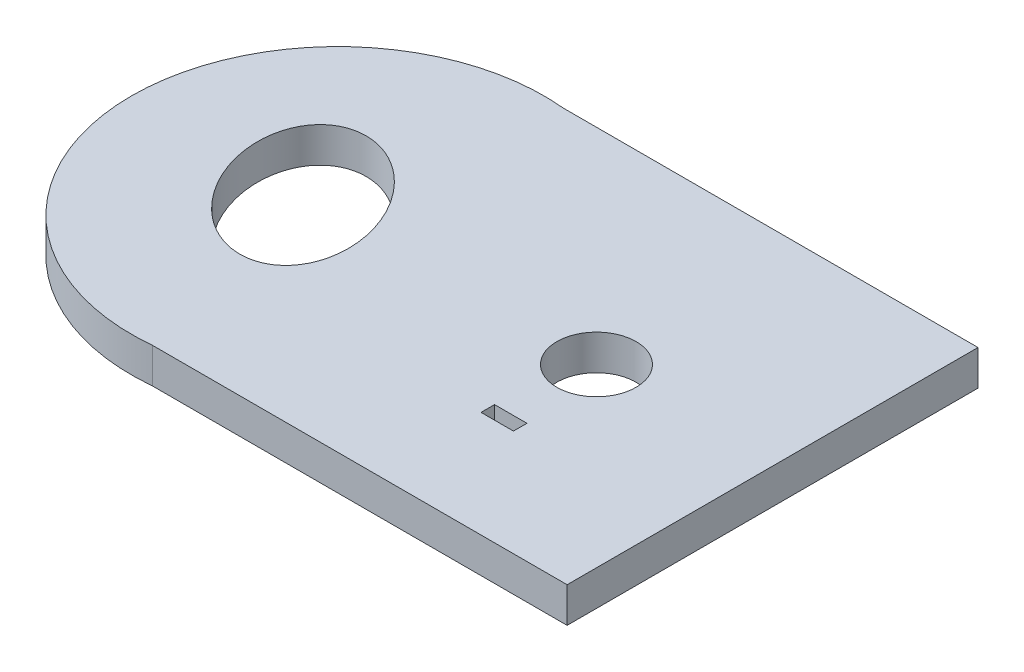
ISO-10303-21;
HEADER;
FILE_DESCRIPTION(('STEP AP214'),'2;1');
FILE_NAME('part.step','',(''),(''),'','','');
FILE_SCHEMA(('AUTOMOTIVE_DESIGN { 1 0 10303 214 1 1 1 1 }'));
ENDSEC;
DATA;
#1=APPLICATION_CONTEXT('core data for automotive mechanical design processes');
#2=APPLICATION_PROTOCOL_DEFINITION('international standard','automotive_design',2000,#1);
#3=PRODUCT_CONTEXT('',#1,'mechanical');
#4=PRODUCT('Part','Part','',(#3));
#5=PRODUCT_RELATED_PRODUCT_CATEGORY('part','',(#4));
#6=PRODUCT_DEFINITION_FORMATION('','',#4);
#7=PRODUCT_DEFINITION_CONTEXT('part definition',#1,'design');
#8=PRODUCT_DEFINITION('design','',#6,#7);
#9=PRODUCT_DEFINITION_SHAPE('','',#8);
#10=(LENGTH_UNIT() NAMED_UNIT(*) SI_UNIT(.MILLI.,.METRE.));
#11=(NAMED_UNIT(*) PLANE_ANGLE_UNIT() SI_UNIT($,.RADIAN.));
#12=(NAMED_UNIT(*) SI_UNIT($,.STERADIAN.) SOLID_ANGLE_UNIT());
#13=UNCERTAINTY_MEASURE_WITH_UNIT(LENGTH_MEASURE(1.E-05),#10,'distance_accuracy_value','');
#14=(GEOMETRIC_REPRESENTATION_CONTEXT(3) GLOBAL_UNCERTAINTY_ASSIGNED_CONTEXT((#13)) GLOBAL_UNIT_ASSIGNED_CONTEXT((#10,
#11,#12)) REPRESENTATION_CONTEXT('',''));
#15=CARTESIAN_POINT('',(0.,0.,0.));
#16=DIRECTION('',(0.,0.,1.));
#17=DIRECTION('',(1.,0.,0.));
#18=AXIS2_PLACEMENT_3D('',#15,#16,#17);
#19=CARTESIAN_POINT('',(0.,3.,0.));
#20=DIRECTION('',(0.,0.,-1.));
#21=DIRECTION('',(-1.,0.,0.));
#22=AXIS2_PLACEMENT_3D('',#19,#20,#21);
#23=PLANE('',#22);
#24=DIRECTION('',(1.,0.,0.));
#25=VECTOR('',#24,1.);
#26=CARTESIAN_POINT('',(0.,0.,0.));
#27=LINE('',#26,#25);
#28=CARTESIAN_POINT('',(0.,0.,0.));
#29=VERTEX_POINT('',#28);
#30=CARTESIAN_POINT('',(35.3325760545056,0.,0.));
#31=VERTEX_POINT('',#30);
#32=EDGE_CURVE('E150',#29,#31,#27,.T.);
#33=ORIENTED_EDGE('',*,*,#32,.F.);
#34=DIRECTION('',(0.,-1.,0.));
#35=VECTOR('',#34,1.);
#36=CARTESIAN_POINT('',(0.,3.,0.));
#37=LINE('',#36,#35);
#38=CARTESIAN_POINT('',(0.,3.,0.));
#39=VERTEX_POINT('',#38);
#40=EDGE_CURVE('E11',#39,#29,#37,.T.);
#41=ORIENTED_EDGE('',*,*,#40,.F.);
#42=DIRECTION('',(1.,0.,0.));
#43=VECTOR('',#42,1.);
#44=CARTESIAN_POINT('',(0.,3.,0.));
#45=LINE('',#44,#43);
#46=CARTESIAN_POINT('',(35.3325760545056,3.,0.));
#47=VERTEX_POINT('',#46);
#48=EDGE_CURVE('E122',#39,#47,#45,.T.);
#49=ORIENTED_EDGE('',*,*,#48,.T.);
#50=DIRECTION('',(0.,-1.,0.));
#51=VECTOR('',#50,1.);
#52=CARTESIAN_POINT('',(35.3325760545056,3.,0.));
#53=LINE('',#52,#51);
#54=EDGE_CURVE('E55',#47,#31,#53,.T.);
#55=ORIENTED_EDGE('',*,*,#54,.T.);
#56=EDGE_LOOP('',(#33,#41,#49,#55));
#57=FACE_BOUND('',#56,.T.);
#58=ADVANCED_FACE('F35',(#57),#23,.T.);
#59=CARTESIAN_POINT('',(-1.70198224129377,3.,17.5));
#60=DIRECTION('',(0.,-1.,0.));
#61=DIRECTION('',(0.,0.,-1.));
#62=AXIS2_PLACEMENT_3D('',#59,#60,#61);
#63=CYLINDRICAL_SURFACE('',#62,17.5825693102481);
#64=CARTESIAN_POINT('',(-1.70198224129377,0.,17.5));
#65=DIRECTION('',(0.,1.,0.));
#66=DIRECTION('',(0.,0.,1.));
#67=AXIS2_PLACEMENT_3D('',#64,#65,#66);
#68=CIRCLE('',#67,17.5825693102481);
#69=CARTESIAN_POINT('',(0.,0.,35.));
#70=VERTEX_POINT('',#69);
#71=EDGE_CURVE('E127',#29,#70,#68,.T.);
#72=ORIENTED_EDGE('',*,*,#71,.T.);
#73=DIRECTION('',(0.,-1.,0.));
#74=VECTOR('',#73,1.);
#75=CARTESIAN_POINT('',(0.,3.,35.));
#76=LINE('',#75,#74);
#77=CARTESIAN_POINT('',(0.,3.,35.));
#78=VERTEX_POINT('',#77);
#79=EDGE_CURVE('E46',#78,#70,#76,.T.);
#80=ORIENTED_EDGE('',*,*,#79,.F.);
#81=CARTESIAN_POINT('',(-1.70198224129377,3.,17.5));
#82=DIRECTION('',(0.,1.,0.));
#83=DIRECTION('',(0.,0.,1.));
#84=AXIS2_PLACEMENT_3D('',#81,#82,#83);
#85=CIRCLE('',#84,17.5825693102481);
#86=EDGE_CURVE('E117',#39,#78,#85,.T.);
#87=ORIENTED_EDGE('',*,*,#86,.F.);
#88=ORIENTED_EDGE('',*,*,#40,.T.);
#89=EDGE_LOOP('',(#72,#80,#87,#88));
#90=FACE_BOUND('',#89,.T.);
#91=ADVANCED_FACE('F125',(#90),#63,.T.);
#92=CARTESIAN_POINT('',(0.,3.,35.));
#93=DIRECTION('',(0.,0.,-1.));
#94=DIRECTION('',(-1.,0.,0.));
#95=AXIS2_PLACEMENT_3D('',#92,#93,#94);
#96=PLANE('',#95);
#97=DIRECTION('',(1.,0.,0.));
#98=VECTOR('',#97,1.);
#99=CARTESIAN_POINT('',(0.,0.,35.));
#100=LINE('',#99,#98);
#101=CARTESIAN_POINT('',(35.3325760545056,0.,35.));
#102=VERTEX_POINT('',#101);
#103=EDGE_CURVE('E147',#70,#102,#100,.T.);
#104=ORIENTED_EDGE('',*,*,#103,.T.);
#105=DIRECTION('',(0.,-1.,0.));
#106=VECTOR('',#105,1.);
#107=CARTESIAN_POINT('',(35.3325760545056,3.,35.));
#108=LINE('',#107,#106);
#109=CARTESIAN_POINT('',(35.3325760545056,3.,35.));
#110=VERTEX_POINT('',#109);
#111=EDGE_CURVE('E81',#110,#102,#108,.T.);
#112=ORIENTED_EDGE('',*,*,#111,.F.);
#113=DIRECTION('',(1.,0.,0.));
#114=VECTOR('',#113,1.);
#115=CARTESIAN_POINT('',(0.,3.,35.));
#116=LINE('',#115,#114);
#117=EDGE_CURVE('E109',#78,#110,#116,.T.);
#118=ORIENTED_EDGE('',*,*,#117,.F.);
#119=ORIENTED_EDGE('',*,*,#79,.T.);
#120=EDGE_LOOP('',(#104,#112,#118,#119));
#121=FACE_BOUND('',#120,.T.);
#122=ADVANCED_FACE('F111',(#121),#96,.F.);
#123=CARTESIAN_POINT('',(0.,3.,24.803095586825));
#124=DIRECTION('',(0.,0.,-1.));
#125=DIRECTION('',(-1.,0.,0.));
#126=AXIS2_PLACEMENT_3D('',#123,#124,#125);
#127=PLANE('',#126);
#128=DIRECTION('',(1.,0.,0.));
#129=VECTOR('',#128,1.);
#130=CARTESIAN_POINT('',(0.,0.,24.803095586825));
#131=LINE('',#130,#129);
#132=CARTESIAN_POINT('',(18.9525760545055,0.,24.803095586825));
#133=VERTEX_POINT('',#132);
#134=CARTESIAN_POINT('',(21.7125760545055,0.,24.803095586825));
#135=VERTEX_POINT('',#134);
#136=EDGE_CURVE('E163',#133,#135,#131,.T.);
#137=ORIENTED_EDGE('',*,*,#136,.T.);
#138=DIRECTION('',(0.,-1.,0.));
#139=VECTOR('',#138,1.);
#140=CARTESIAN_POINT('',(21.7125760545055,3.,24.803095586825));
#141=LINE('',#140,#139);
#142=CARTESIAN_POINT('',(21.7125760545055,3.,24.803095586825));
#143=VERTEX_POINT('',#142);
#144=EDGE_CURVE('E40',#143,#135,#141,.T.);
#145=ORIENTED_EDGE('',*,*,#144,.F.);
#146=DIRECTION('',(1.,0.,0.));
#147=VECTOR('',#146,1.);
#148=CARTESIAN_POINT('',(0.,3.,24.803095586825));
#149=LINE('',#148,#147);
#150=CARTESIAN_POINT('',(18.9525760545055,3.,24.803095586825));
#151=VERTEX_POINT('',#150);
#152=EDGE_CURVE('E179',#151,#143,#149,.T.);
#153=ORIENTED_EDGE('',*,*,#152,.F.);
#154=DIRECTION('',(0.,-1.,0.));
#155=VECTOR('',#154,1.);
#156=CARTESIAN_POINT('',(18.9525760545055,3.,24.803095586825));
#157=LINE('',#156,#155);
#158=EDGE_CURVE('E132',#151,#133,#157,.T.);
#159=ORIENTED_EDGE('',*,*,#158,.T.);
#160=EDGE_LOOP('',(#137,#145,#153,#159));
#161=FACE_BOUND('',#160,.T.);
#162=ADVANCED_FACE('F227',(#161),#127,.F.);
#163=CARTESIAN_POINT('',(21.7125760545055,3.,0.));
#164=DIRECTION('',(1.,0.,0.));
#165=DIRECTION('',(0.,0.,-1.));
#166=AXIS2_PLACEMENT_3D('',#163,#164,#165);
#167=PLANE('',#166);
#168=DIRECTION('',(0.,0.,1.));
#169=VECTOR('',#168,1.);
#170=CARTESIAN_POINT('',(21.7125760545055,0.,0.));
#171=LINE('',#170,#169);
#172=CARTESIAN_POINT('',(21.7125760545055,0.,25.953095586825));
#173=VERTEX_POINT('',#172);
#174=EDGE_CURVE('E161',#135,#173,#171,.T.);
#175=ORIENTED_EDGE('',*,*,#174,.T.);
#176=DIRECTION('',(0.,-1.,0.));
#177=VECTOR('',#176,1.);
#178=CARTESIAN_POINT('',(21.7125760545055,3.,25.953095586825));
#179=LINE('',#178,#177);
#180=CARTESIAN_POINT('',(21.7125760545055,3.,25.953095586825));
#181=VERTEX_POINT('',#180);
#182=EDGE_CURVE('E135',#181,#173,#179,.T.);
#183=ORIENTED_EDGE('',*,*,#182,.F.);
#184=DIRECTION('',(0.,0.,1.));
#185=VECTOR('',#184,1.);
#186=CARTESIAN_POINT('',(21.7125760545055,3.,0.));
#187=LINE('',#186,#185);
#188=EDGE_CURVE('E94',#143,#181,#187,.T.);
#189=ORIENTED_EDGE('',*,*,#188,.F.);
#190=ORIENTED_EDGE('',*,*,#144,.T.);
#191=EDGE_LOOP('',(#175,#183,#189,#190));
#192=FACE_BOUND('',#191,.T.);
#193=ADVANCED_FACE('F225',(#192),#167,.F.);
#194=CARTESIAN_POINT('',(0.,3.,25.953095586825));
#195=DIRECTION('',(0.,0.,-1.));
#196=DIRECTION('',(-1.,0.,0.));
#197=AXIS2_PLACEMENT_3D('',#194,#195,#196);
#198=PLANE('',#197);
#199=DIRECTION('',(1.,0.,0.));
#200=VECTOR('',#199,1.);
#201=CARTESIAN_POINT('',(0.,0.,25.953095586825));
#202=LINE('',#201,#200);
#203=CARTESIAN_POINT('',(18.9525760545055,0.,25.953095586825));
#204=VERTEX_POINT('',#203);
#205=EDGE_CURVE('E158',#204,#173,#202,.T.);
#206=ORIENTED_EDGE('',*,*,#205,.F.);
#207=DIRECTION('',(0.,-1.,0.));
#208=VECTOR('',#207,1.);
#209=CARTESIAN_POINT('',(18.9525760545055,3.,25.953095586825));
#210=LINE('',#209,#208);
#211=CARTESIAN_POINT('',(18.9525760545055,3.,25.953095586825));
#212=VERTEX_POINT('',#211);
#213=EDGE_CURVE('E134',#212,#204,#210,.T.);
#214=ORIENTED_EDGE('',*,*,#213,.F.);
#215=DIRECTION('',(1.,0.,0.));
#216=VECTOR('',#215,1.);
#217=CARTESIAN_POINT('',(0.,3.,25.953095586825));
#218=LINE('',#217,#216);
#219=EDGE_CURVE('E176',#212,#181,#218,.T.);
#220=ORIENTED_EDGE('',*,*,#219,.T.);
#221=ORIENTED_EDGE('',*,*,#182,.T.);
#222=EDGE_LOOP('',(#206,#214,#220,#221));
#223=FACE_BOUND('',#222,.T.);
#224=ADVANCED_FACE('F218',(#223),#198,.T.);
#225=CARTESIAN_POINT('',(20.3325760545055,3.,17.5));
#226=DIRECTION('',(0.,-1.,0.));
#227=DIRECTION('',(0.,0.,-1.));
#228=AXIS2_PLACEMENT_3D('',#225,#226,#227);
#229=CYLINDRICAL_SURFACE('',#228,3.375);
#230=CARTESIAN_POINT('',(20.3325760545055,3.,17.5));
#231=DIRECTION('',(0.,1.,0.));
#232=DIRECTION('',(0.,0.,1.));
#233=AXIS2_PLACEMENT_3D('',#230,#231,#232);
#234=CIRCLE('',#233,3.375);
#235=CARTESIAN_POINT('',(20.3325760545055,3.,20.875));
#236=VERTEX_POINT('',#235);
#237=EDGE_CURVE('E170',#236,#236,#234,.T.);
#238=ORIENTED_EDGE('',*,*,#237,.T.);
#239=EDGE_LOOP('',(#238));
#240=FACE_BOUND('',#239,.T.);
#241=CARTESIAN_POINT('',(20.3325760545055,0.,17.5));
#242=DIRECTION('',(0.,1.,0.));
#243=DIRECTION('',(0.,0.,1.));
#244=AXIS2_PLACEMENT_3D('',#241,#242,#243);
#245=CIRCLE('',#244,3.375);
#246=CARTESIAN_POINT('',(20.3325760545055,0.,20.875));
#247=VERTEX_POINT('',#246);
#248=EDGE_CURVE('E152',#247,#247,#245,.T.);
#249=ORIENTED_EDGE('',*,*,#248,.F.);
#250=EDGE_LOOP('',(#249));
#251=FACE_BOUND('',#250,.T.);
#252=ADVANCED_FACE('F215',(#240,#251),#229,.F.);
#253=CARTESIAN_POINT('',(18.9525760545055,3.,0.));
#254=DIRECTION('',(1.,0.,0.));
#255=DIRECTION('',(0.,0.,-1.));
#256=AXIS2_PLACEMENT_3D('',#253,#254,#255);
#257=PLANE('',#256);
#258=DIRECTION('',(0.,0.,1.));
#259=VECTOR('',#258,1.);
#260=CARTESIAN_POINT('',(18.9525760545055,0.,0.));
#261=LINE('',#260,#259);
#262=EDGE_CURVE('E155',#133,#204,#261,.T.);
#263=ORIENTED_EDGE('',*,*,#262,.F.);
#264=ORIENTED_EDGE('',*,*,#158,.F.);
#265=DIRECTION('',(0.,0.,1.));
#266=VECTOR('',#265,1.);
#267=CARTESIAN_POINT('',(18.9525760545055,3.,0.));
#268=LINE('',#267,#266);
#269=EDGE_CURVE('E173',#151,#212,#268,.T.);
#270=ORIENTED_EDGE('',*,*,#269,.T.);
#271=ORIENTED_EDGE('',*,*,#213,.T.);
#272=EDGE_LOOP('',(#263,#264,#270,#271));
#273=FACE_BOUND('',#272,.T.);
#274=ADVANCED_FACE('F189',(#273),#257,.T.);
#275=CARTESIAN_POINT('',(-4.66742394549448,3.,17.5));
#276=DIRECTION('',(0.,-1.,0.));
#277=DIRECTION('',(0.479146138874851,0.,0.877735140917419));
#278=AXIS2_PLACEMENT_3D('',#275,#276,#277);
#279=ELLIPSE('',#278,7.50000000000003,5.30000000000004);
#280=DIRECTION('',(0.,-1.,0.));
#281=VECTOR('',#280,1.);
#282=SURFACE_OF_LINEAR_EXTRUSION('',#279,#281);
#283=CARTESIAN_POINT('',(-1.07382790393309,3.,24.0830135568807));
#284=VERTEX_POINT('',#283);
#285=EDGE_CURVE('E146',#284,#284,#279,.T.);
#286=ORIENTED_EDGE('',*,*,#285,.F.);
#287=EDGE_LOOP('',(#286));
#288=FACE_BOUND('',#287,.T.);
#289=CARTESIAN_POINT('',(-4.66742394549448,0.,17.5));
#290=DIRECTION('',(0.,-1.,0.));
#291=DIRECTION('',(0.479146138874851,0.,0.877735140917419));
#292=AXIS2_PLACEMENT_3D('',#289,#290,#291);
#293=ELLIPSE('',#292,7.50000000000003,5.30000000000004);
#294=CARTESIAN_POINT('',(-1.07382790393309,0.,24.0830135568807));
#295=VERTEX_POINT('',#294);
#296=EDGE_CURVE('E165',#295,#295,#293,.T.);
#297=ORIENTED_EDGE('',*,*,#296,.T.);
#298=EDGE_LOOP('',(#297));
#299=FACE_BOUND('',#298,.T.);
#300=ADVANCED_FACE('F37',(#288,#299),#282,.F.);
#301=CARTESIAN_POINT('',(35.3325760545056,3.,0.));
#302=DIRECTION('',(1.,0.,0.));
#303=DIRECTION('',(0.,0.,-1.));
#304=AXIS2_PLACEMENT_3D('',#301,#302,#303);
#305=PLANE('',#304);
#306=DIRECTION('',(0.,0.,1.));
#307=VECTOR('',#306,1.);
#308=CARTESIAN_POINT('',(35.3325760545056,0.,0.));
#309=LINE('',#308,#307);
#310=EDGE_CURVE('E143',#31,#102,#309,.T.);
#311=ORIENTED_EDGE('',*,*,#310,.F.);
#312=ORIENTED_EDGE('',*,*,#54,.F.);
#313=DIRECTION('',(0.,0.,1.));
#314=VECTOR('',#313,1.);
#315=CARTESIAN_POINT('',(35.3325760545056,3.,0.));
#316=LINE('',#315,#314);
#317=EDGE_CURVE('E116',#47,#110,#316,.T.);
#318=ORIENTED_EDGE('',*,*,#317,.T.);
#319=ORIENTED_EDGE('',*,*,#111,.T.);
#320=EDGE_LOOP('',(#311,#312,#318,#319));
#321=FACE_BOUND('',#320,.T.);
#322=ADVANCED_FACE('F188',(#321),#305,.T.);
#323=CARTESIAN_POINT('',(0.,3.,0.));
#324=DIRECTION('',(0.,1.,0.));
#325=DIRECTION('',(0.,0.,1.));
#326=AXIS2_PLACEMENT_3D('',#323,#324,#325);
#327=PLANE('',#326);
#328=ORIENTED_EDGE('',*,*,#285,.T.);
#329=EDGE_LOOP('',(#328));
#330=FACE_BOUND('',#329,.T.);
#331=ORIENTED_EDGE('',*,*,#152,.T.);
#332=ORIENTED_EDGE('',*,*,#188,.T.);
#333=ORIENTED_EDGE('',*,*,#219,.F.);
#334=ORIENTED_EDGE('',*,*,#269,.F.);
#335=EDGE_LOOP('',(#331,#332,#333,#334));
#336=FACE_BOUND('',#335,.T.);
#337=ORIENTED_EDGE('',*,*,#237,.F.);
#338=EDGE_LOOP('',(#337));
#339=FACE_BOUND('',#338,.T.);
#340=ORIENTED_EDGE('',*,*,#48,.F.);
#341=ORIENTED_EDGE('',*,*,#86,.T.);
#342=ORIENTED_EDGE('',*,*,#117,.T.);
#343=ORIENTED_EDGE('',*,*,#317,.F.);
#344=EDGE_LOOP('',(#340,#341,#342,#343));
#345=FACE_BOUND('',#344,.T.);
#346=ADVANCED_FACE('F121',(#330,#336,#339,#345),#327,.T.);
#347=CARTESIAN_POINT('',(0.,0.,0.));
#348=DIRECTION('',(0.,1.,0.));
#349=DIRECTION('',(0.,0.,1.));
#350=AXIS2_PLACEMENT_3D('',#347,#348,#349);
#351=PLANE('',#350);
#352=ORIENTED_EDGE('',*,*,#296,.F.);
#353=EDGE_LOOP('',(#352));
#354=FACE_BOUND('',#353,.T.);
#355=ORIENTED_EDGE('',*,*,#136,.F.);
#356=ORIENTED_EDGE('',*,*,#262,.T.);
#357=ORIENTED_EDGE('',*,*,#205,.T.);
#358=ORIENTED_EDGE('',*,*,#174,.F.);
#359=EDGE_LOOP('',(#355,#356,#357,#358));
#360=FACE_BOUND('',#359,.T.);
#361=ORIENTED_EDGE('',*,*,#248,.T.);
#362=EDGE_LOOP('',(#361));
#363=FACE_BOUND('',#362,.T.);
#364=ORIENTED_EDGE('',*,*,#32,.T.);
#365=ORIENTED_EDGE('',*,*,#310,.T.);
#366=ORIENTED_EDGE('',*,*,#103,.F.);
#367=ORIENTED_EDGE('',*,*,#71,.F.);
#368=EDGE_LOOP('',(#364,#365,#366,#367));
#369=FACE_BOUND('',#368,.T.);
#370=ADVANCED_FACE('F192',(#354,#360,#363,#369),#351,.F.);
#371=CLOSED_SHELL('',(#58,#91,#122,#162,#193,#224,#252,#274,#300,#322,#346,#370));
#372=MANIFOLD_SOLID_BREP('B2',#371);
#373=ADVANCED_BREP_SHAPE_REPRESENTATION('',(#18,#372),#14);
#374=SHAPE_DEFINITION_REPRESENTATION(#9,#373);
ENDSEC;
END-ISO-10303-21;
